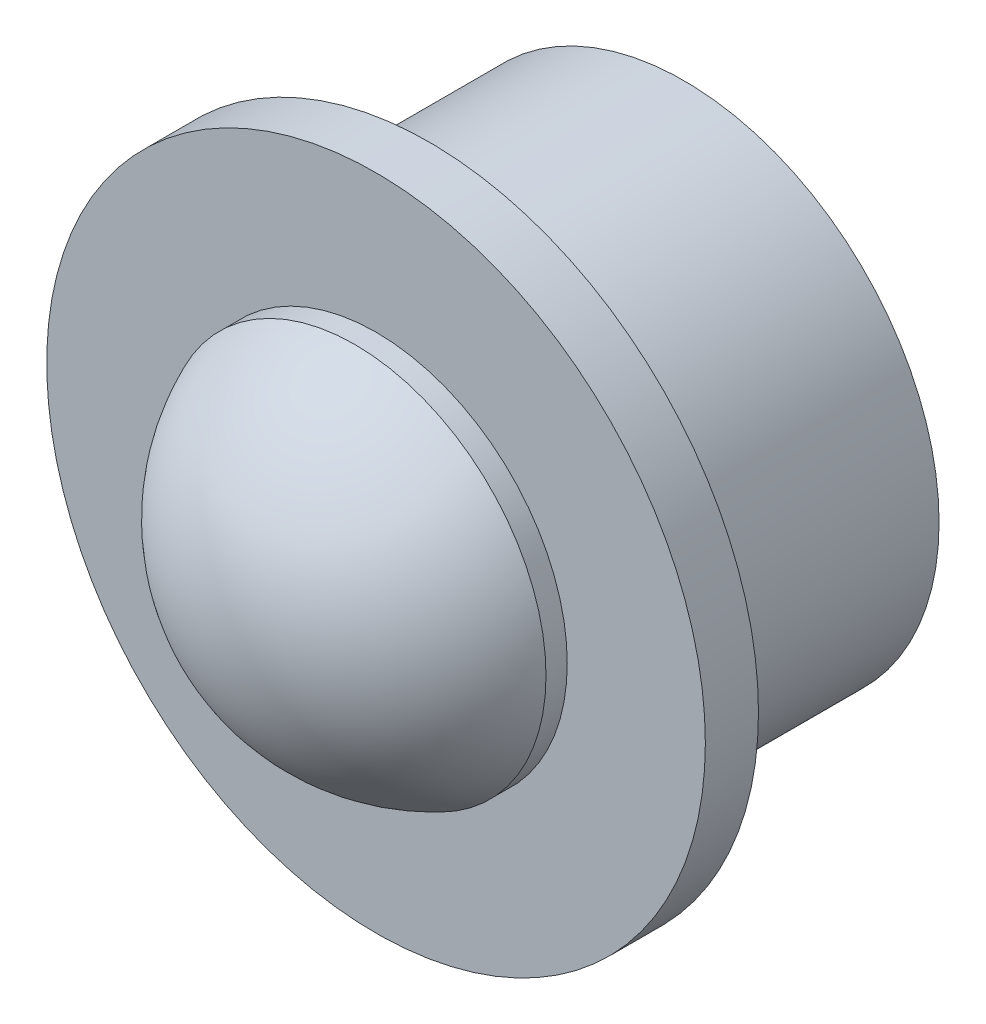
ISO-10303-21;
HEADER;
FILE_DESCRIPTION(('STEP AP214'),'2;1');
FILE_NAME('part.step','',(''),(''),'','','');
FILE_SCHEMA(('AUTOMOTIVE_DESIGN { 1 0 10303 214 1 1 1 1 }'));
ENDSEC;
DATA;
#1=APPLICATION_CONTEXT('core data for automotive mechanical design processes');
#2=APPLICATION_PROTOCOL_DEFINITION('international standard','automotive_design',2000,#1);
#3=PRODUCT_CONTEXT('',#1,'mechanical');
#4=PRODUCT('Part','Part','',(#3));
#5=PRODUCT_RELATED_PRODUCT_CATEGORY('part','',(#4));
#6=PRODUCT_DEFINITION_FORMATION('','',#4);
#7=PRODUCT_DEFINITION_CONTEXT('part definition',#1,'design');
#8=PRODUCT_DEFINITION('design','',#6,#7);
#9=PRODUCT_DEFINITION_SHAPE('','',#8);
#10=(LENGTH_UNIT() NAMED_UNIT(*) SI_UNIT(.MILLI.,.METRE.));
#11=(NAMED_UNIT(*) PLANE_ANGLE_UNIT() SI_UNIT($,.RADIAN.));
#12=(NAMED_UNIT(*) SI_UNIT($,.STERADIAN.) SOLID_ANGLE_UNIT());
#13=UNCERTAINTY_MEASURE_WITH_UNIT(LENGTH_MEASURE(1.E-05),#10,'distance_accuracy_value','');
#14=(GEOMETRIC_REPRESENTATION_CONTEXT(3) GLOBAL_UNCERTAINTY_ASSIGNED_CONTEXT((#13)) GLOBAL_UNIT_ASSIGNED_CONTEXT((#10,
#11,#12)) REPRESENTATION_CONTEXT('',''));
#15=CARTESIAN_POINT('',(0.,0.,0.));
#16=DIRECTION('',(0.,0.,1.));
#17=DIRECTION('',(1.,0.,0.));
#18=AXIS2_PLACEMENT_3D('',#15,#16,#17);
#19=CARTESIAN_POINT('',(0.,0.,14.5));
#20=DIRECTION('',(0.,0.,1.));
#21=DIRECTION('',(1.,0.,0.));
#22=AXIS2_PLACEMENT_3D('',#19,#20,#21);
#23=PLANE('',#22);
#24=CARTESIAN_POINT('',(0.,0.,14.5));
#25=DIRECTION('',(0.,0.,1.));
#26=DIRECTION('',(1.,0.,0.));
#27=AXIS2_PLACEMENT_3D('',#24,#25,#26);
#28=CIRCLE('',#27,15.5);
#29=CARTESIAN_POINT('',(15.5,0.,14.5));
#30=VERTEX_POINT('',#29);
#31=EDGE_CURVE('E42',#30,#30,#28,.T.);
#32=ORIENTED_EDGE('',*,*,#31,.T.);
#33=EDGE_LOOP('',(#32));
#34=FACE_BOUND('',#33,.T.);
#35=CARTESIAN_POINT('',(0.,0.,14.5));
#36=DIRECTION('',(0.,0.,1.));
#37=DIRECTION('',(1.,0.,0.));
#38=AXIS2_PLACEMENT_3D('',#35,#36,#37);
#39=CIRCLE('',#38,9.);
#40=CARTESIAN_POINT('',(9.,0.,14.5));
#41=VERTEX_POINT('',#40);
#42=EDGE_CURVE('E49',#41,#41,#39,.T.);
#43=ORIENTED_EDGE('',*,*,#42,.F.);
#44=EDGE_LOOP('',(#43));
#45=FACE_BOUND('',#44,.T.);
#46=ADVANCED_FACE('F29',(#34,#45),#23,.T.);
#47=CARTESIAN_POINT('',(0.,0.,12.));
#48=DIRECTION('',(0.,0.,-1.));
#49=DIRECTION('',(-1.,0.,0.));
#50=AXIS2_PLACEMENT_3D('',#47,#48,#49);
#51=CYLINDRICAL_SURFACE('',#50,12.);
#52=CARTESIAN_POINT('',(0.,0.,12.));
#53=DIRECTION('',(0.,0.,1.));
#54=DIRECTION('',(1.,0.,0.));
#55=AXIS2_PLACEMENT_3D('',#52,#53,#54);
#56=CIRCLE('',#55,12.);
#57=CARTESIAN_POINT('',(12.,0.,12.));
#58=VERTEX_POINT('',#57);
#59=EDGE_CURVE('E10',#58,#58,#56,.T.);
#60=ORIENTED_EDGE('',*,*,#59,.F.);
#61=EDGE_LOOP('',(#60));
#62=FACE_BOUND('',#61,.T.);
#63=CARTESIAN_POINT('',(0.,0.,0.));
#64=DIRECTION('',(0.,0.,1.));
#65=DIRECTION('',(1.,0.,0.));
#66=AXIS2_PLACEMENT_3D('',#63,#64,#65);
#67=CIRCLE('',#66,12.);
#68=CARTESIAN_POINT('',(12.,0.,0.));
#69=VERTEX_POINT('',#68);
#70=EDGE_CURVE('E37',#69,#69,#67,.T.);
#71=ORIENTED_EDGE('',*,*,#70,.T.);
#72=EDGE_LOOP('',(#71));
#73=FACE_BOUND('',#72,.T.);
#74=ADVANCED_FACE('F70',(#62,#73),#51,.T.);
#75=CARTESIAN_POINT('',(0.,0.,0.));
#76=DIRECTION('',(0.,0.,1.));
#77=DIRECTION('',(1.,0.,0.));
#78=AXIS2_PLACEMENT_3D('',#75,#76,#77);
#79=PLANE('',#78);
#80=ORIENTED_EDGE('',*,*,#70,.F.);
#81=EDGE_LOOP('',(#80));
#82=FACE_BOUND('',#81,.T.);
#83=ADVANCED_FACE('F75',(#82),#79,.F.);
#84=CARTESIAN_POINT('',(0.,0.,12.));
#85=DIRECTION('',(0.,0.,1.));
#86=DIRECTION('',(1.,0.,0.));
#87=AXIS2_PLACEMENT_3D('',#84,#85,#86);
#88=PLANE('',#87);
#89=CARTESIAN_POINT('',(0.,0.,12.));
#90=DIRECTION('',(0.,0.,1.));
#91=DIRECTION('',(1.,0.,0.));
#92=AXIS2_PLACEMENT_3D('',#89,#90,#91);
#93=CIRCLE('',#92,15.5);
#94=CARTESIAN_POINT('',(15.5,0.,12.));
#95=VERTEX_POINT('',#94);
#96=EDGE_CURVE('E44',#95,#95,#93,.T.);
#97=ORIENTED_EDGE('',*,*,#96,.F.);
#98=EDGE_LOOP('',(#97));
#99=FACE_BOUND('',#98,.T.);
#100=ORIENTED_EDGE('',*,*,#59,.T.);
#101=EDGE_LOOP('',(#100));
#102=FACE_BOUND('',#101,.T.);
#103=ADVANCED_FACE('F65',(#99,#102),#88,.F.);
#104=CARTESIAN_POINT('',(0.,0.,14.5));
#105=DIRECTION('',(0.,0.,-1.));
#106=DIRECTION('',(-1.,0.,0.));
#107=AXIS2_PLACEMENT_3D('',#104,#105,#106);
#108=CYLINDRICAL_SURFACE('',#107,15.5);
#109=ORIENTED_EDGE('',*,*,#31,.F.);
#110=EDGE_LOOP('',(#109));
#111=FACE_BOUND('',#110,.T.);
#112=ORIENTED_EDGE('',*,*,#96,.T.);
#113=EDGE_LOOP('',(#112));
#114=FACE_BOUND('',#113,.T.);
#115=ADVANCED_FACE('F59',(#111,#114),#108,.T.);
#116=CARTESIAN_POINT('',(0.,0.,15.5));
#117=DIRECTION('',(0.,0.,-1.));
#118=DIRECTION('',(-1.,0.,0.));
#119=AXIS2_PLACEMENT_3D('',#116,#117,#118);
#120=CYLINDRICAL_SURFACE('',#119,9.);
#121=CARTESIAN_POINT('',(0.,0.,15.5));
#122=DIRECTION('',(0.,0.,1.));
#123=DIRECTION('',(1.,0.,0.));
#124=AXIS2_PLACEMENT_3D('',#121,#122,#123);
#125=CIRCLE('',#124,9.);
#126=CARTESIAN_POINT('',(9.,0.,15.5));
#127=VERTEX_POINT('',#126);
#128=EDGE_CURVE('E33',#127,#127,#125,.T.);
#129=ORIENTED_EDGE('',*,*,#128,.F.);
#130=EDGE_LOOP('',(#129));
#131=FACE_BOUND('',#130,.T.);
#132=ORIENTED_EDGE('',*,*,#42,.T.);
#133=EDGE_LOOP('',(#132));
#134=FACE_BOUND('',#133,.T.);
#135=ADVANCED_FACE('F57',(#131,#134),#120,.T.);
#136=CARTESIAN_POINT('',(0.,0.,11.75));
#137=DIRECTION('',(0.,0.,1.));
#138=DIRECTION('',(1.,0.,0.));
#139=AXIS2_PLACEMENT_3D('',#136,#137,#138);
#140=SPHERICAL_SURFACE('',#139,9.75);
#141=ORIENTED_EDGE('',*,*,#128,.T.);
#142=EDGE_LOOP('',(#141));
#143=FACE_BOUND('',#142,.T.);
#144=ADVANCED_FACE('F31',(#143),#140,.T.);
#145=CLOSED_SHELL('',(#46,#74,#83,#103,#115,#135,#144));
#146=MANIFOLD_SOLID_BREP('B2',#145);
#147=ADVANCED_BREP_SHAPE_REPRESENTATION('',(#18,#146),#14);
#148=SHAPE_DEFINITION_REPRESENTATION(#9,#147);
ENDSEC;
END-ISO-10303-21;
